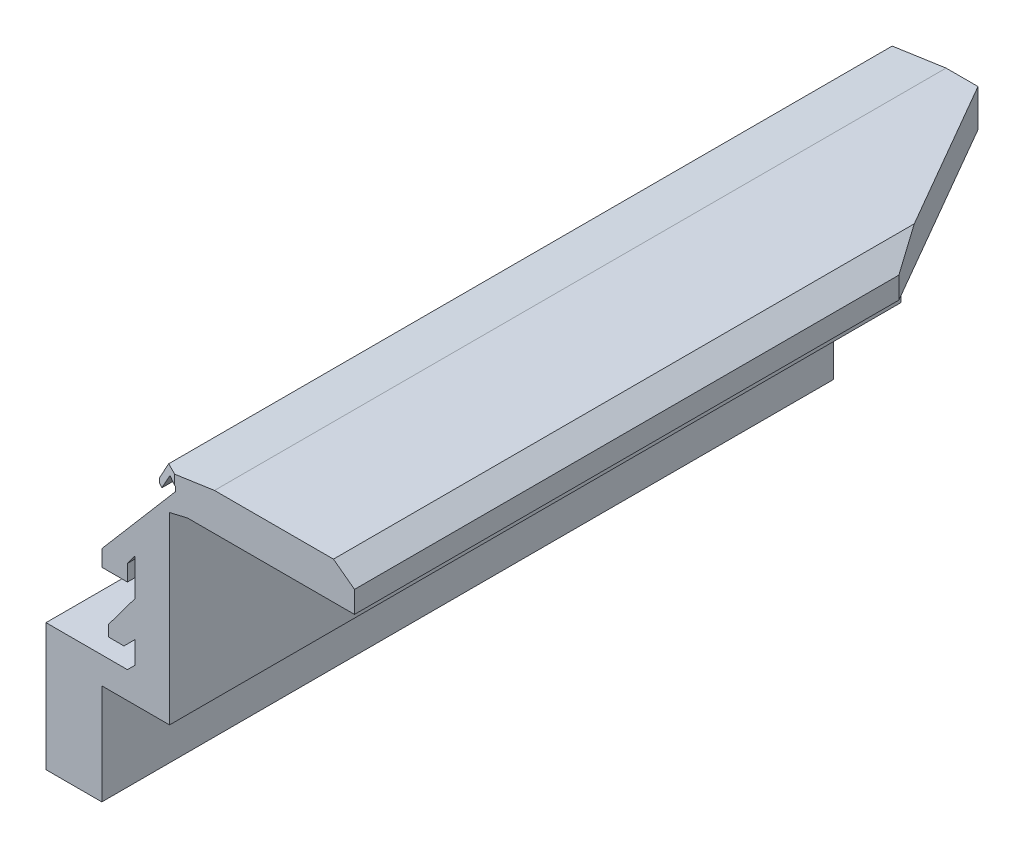
ISO-10303-21;
HEADER;
FILE_DESCRIPTION(('STEP AP214'),'2;1');
FILE_NAME('part.step','',(''),(''),'','','');
FILE_SCHEMA(('AUTOMOTIVE_DESIGN { 1 0 10303 214 1 1 1 1 }'));
ENDSEC;
DATA;
#1=APPLICATION_CONTEXT('core data for automotive mechanical design processes');
#2=APPLICATION_PROTOCOL_DEFINITION('international standard','automotive_design',2000,#1);
#3=PRODUCT_CONTEXT('',#1,'mechanical');
#4=PRODUCT('Part','Part','',(#3));
#5=PRODUCT_RELATED_PRODUCT_CATEGORY('part','',(#4));
#6=PRODUCT_DEFINITION_FORMATION('','',#4);
#7=PRODUCT_DEFINITION_CONTEXT('part definition',#1,'design');
#8=PRODUCT_DEFINITION('design','',#6,#7);
#9=PRODUCT_DEFINITION_SHAPE('','',#8);
#10=(LENGTH_UNIT() NAMED_UNIT(*) SI_UNIT(.MILLI.,.METRE.));
#11=(NAMED_UNIT(*) PLANE_ANGLE_UNIT() SI_UNIT($,.RADIAN.));
#12=(NAMED_UNIT(*) SI_UNIT($,.STERADIAN.) SOLID_ANGLE_UNIT());
#13=UNCERTAINTY_MEASURE_WITH_UNIT(LENGTH_MEASURE(1.E-05),#10,'distance_accuracy_value','');
#14=(GEOMETRIC_REPRESENTATION_CONTEXT(3) GLOBAL_UNCERTAINTY_ASSIGNED_CONTEXT((#13)) GLOBAL_UNIT_ASSIGNED_CONTEXT((#10,
#11,#12)) REPRESENTATION_CONTEXT('',''));
#15=CARTESIAN_POINT('',(0.,0.,0.));
#16=DIRECTION('',(0.,0.,1.));
#17=DIRECTION('',(1.,0.,0.));
#18=AXIS2_PLACEMENT_3D('',#15,#16,#17);
#19=CARTESIAN_POINT('',(36.549287828912,78.6677673377594,1636.));
#20=DIRECTION('',(-1.,0.,0.));
#21=DIRECTION('',(0.,0.,1.));
#22=AXIS2_PLACEMENT_3D('',#19,#20,#21);
#23=PLANE('',#22);
#24=DIRECTION('',(0.,1.,0.));
#25=VECTOR('',#24,1.);
#26=CARTESIAN_POINT('',(36.549287828912,78.6677673377594,1548.));
#27=LINE('',#26,#25);
#28=CARTESIAN_POINT('',(36.549287828912,66.5695189168191,1548.));
#29=VERTEX_POINT('',#28);
#30=CARTESIAN_POINT('',(36.549287828912,78.6677673377594,1548.));
#31=VERTEX_POINT('',#30);
#32=EDGE_CURVE('E265',#29,#31,#27,.T.);
#33=ORIENTED_EDGE('',*,*,#32,.T.);
#34=DIRECTION('',(0.,0.,-1.));
#35=VECTOR('',#34,1.);
#36=CARTESIAN_POINT('',(36.549287828912,78.6677673377594,1636.));
#37=LINE('',#36,#35);
#38=CARTESIAN_POINT('',(36.549287828912,78.6677673377594,1636.));
#39=VERTEX_POINT('',#38);
#40=EDGE_CURVE('E245',#39,#31,#37,.T.);
#41=ORIENTED_EDGE('',*,*,#40,.F.);
#42=DIRECTION('',(0.,1.,0.));
#43=VECTOR('',#42,1.);
#44=CARTESIAN_POINT('',(36.549287828912,78.6677673377594,1636.));
#45=LINE('',#44,#43);
#46=CARTESIAN_POINT('',(36.549287828912,66.5695189168191,1636.));
#47=VERTEX_POINT('',#46);
#48=EDGE_CURVE('E252',#47,#39,#45,.T.);
#49=ORIENTED_EDGE('',*,*,#48,.F.);
#50=DIRECTION('',(0.,0.,-1.));
#51=VECTOR('',#50,1.);
#52=CARTESIAN_POINT('',(36.549287828912,66.5695189168191,1636.));
#53=LINE('',#52,#51);
#54=EDGE_CURVE('E358',#47,#29,#53,.T.);
#55=ORIENTED_EDGE('',*,*,#54,.T.);
#56=EDGE_LOOP('',(#33,#41,#49,#55));
#57=FACE_BOUND('',#56,.T.);
#58=ADVANCED_FACE('F33',(#57),#23,.F.);
#59=CARTESIAN_POINT('',(44.6942077480382,78.6677673377594,1636.));
#60=DIRECTION('',(0.,1.,0.));
#61=DIRECTION('',(0.,0.,1.));
#62=AXIS2_PLACEMENT_3D('',#59,#60,#61);
#63=PLANE('',#62);
#64=DIRECTION('',(1.,0.,0.));
#65=VECTOR('',#64,1.);
#66=CARTESIAN_POINT('',(44.6942077480382,78.6677673377594,1548.));
#67=LINE('',#66,#65);
#68=CARTESIAN_POINT('',(44.6942077480382,78.6677673377594,1548.));
#69=VERTEX_POINT('',#68);
#70=EDGE_CURVE('E360',#31,#69,#67,.T.);
#71=ORIENTED_EDGE('',*,*,#70,.T.);
#72=DIRECTION('',(0.,0.,-1.));
#73=VECTOR('',#72,1.);
#74=CARTESIAN_POINT('',(44.6942077480382,78.6677673377594,1636.));
#75=LINE('',#74,#73);
#76=CARTESIAN_POINT('',(44.6942077480382,78.6677673377594,1636.));
#77=VERTEX_POINT('',#76);
#78=EDGE_CURVE('E248',#77,#69,#75,.T.);
#79=ORIENTED_EDGE('',*,*,#78,.F.);
#80=DIRECTION('',(1.,0.,0.));
#81=VECTOR('',#80,1.);
#82=CARTESIAN_POINT('',(44.6942077480382,78.6677673377594,1636.));
#83=LINE('',#82,#81);
#84=EDGE_CURVE('E241',#39,#77,#83,.T.);
#85=ORIENTED_EDGE('',*,*,#84,.F.);
#86=ORIENTED_EDGE('',*,*,#40,.T.);
#87=EDGE_LOOP('',(#71,#79,#85,#86));
#88=FACE_BOUND('',#87,.T.);
#89=ADVANCED_FACE('F243',(#88),#63,.F.);
#90=CARTESIAN_POINT('',(44.6942077480382,100.794644613452,1636.));
#91=DIRECTION('',(-1.,0.,0.));
#92=DIRECTION('',(0.,0.,1.));
#93=AXIS2_PLACEMENT_3D('',#90,#91,#92);
#94=PLANE('',#93);
#95=DIRECTION('',(0.,1.,0.));
#96=VECTOR('',#95,1.);
#97=CARTESIAN_POINT('',(44.6942077480382,100.794644613452,1548.));
#98=LINE('',#97,#96);
#99=CARTESIAN_POINT('',(44.6942077480382,100.794644613452,1548.));
#100=VERTEX_POINT('',#99);
#101=EDGE_CURVE('E362',#69,#100,#98,.T.);
#102=ORIENTED_EDGE('',*,*,#101,.T.);
#103=DIRECTION('',(0.,0.,-1.));
#104=VECTOR('',#103,1.);
#105=CARTESIAN_POINT('',(44.6942077480382,100.794644613452,1636.));
#106=LINE('',#105,#104);
#107=CARTESIAN_POINT('',(44.6942077480382,100.794644613452,1636.));
#108=VERTEX_POINT('',#107);
#109=EDGE_CURVE('E271',#108,#100,#106,.T.);
#110=ORIENTED_EDGE('',*,*,#109,.F.);
#111=DIRECTION('',(0.,1.,0.));
#112=VECTOR('',#111,1.);
#113=CARTESIAN_POINT('',(44.6942077480382,100.794644613452,1636.));
#114=LINE('',#113,#112);
#115=EDGE_CURVE('E251',#77,#108,#114,.T.);
#116=ORIENTED_EDGE('',*,*,#115,.F.);
#117=ORIENTED_EDGE('',*,*,#78,.T.);
#118=EDGE_LOOP('',(#102,#110,#116,#117));
#119=FACE_BOUND('',#118,.T.);
#120=ADVANCED_FACE('F520',(#119),#94,.F.);
#121=CARTESIAN_POINT('',(46.86035806441,101.303626457644,1636.));
#122=DIRECTION('',(-0.228740991254405,0.973487318314909,0.));
#123=DIRECTION('',(-0.973487318314909,-0.228740991254405,0.));
#124=AXIS2_PLACEMENT_3D('',#121,#122,#123);
#125=PLANE('',#124);
#126=DIRECTION('',(0.973487318314909,0.228740991254405,0.));
#127=VECTOR('',#126,1.);
#128=CARTESIAN_POINT('',(46.86035806441,101.303626457644,1548.));
#129=LINE('',#128,#127);
#130=CARTESIAN_POINT('',(46.86035806441,101.303626457644,1548.));
#131=VERTEX_POINT('',#130);
#132=EDGE_CURVE('E364',#100,#131,#129,.T.);
#133=ORIENTED_EDGE('',*,*,#132,.T.);
#134=DIRECTION('',(0.,0.,-1.));
#135=VECTOR('',#134,1.);
#136=CARTESIAN_POINT('',(46.86035806441,101.303626457644,1636.));
#137=LINE('',#136,#135);
#138=CARTESIAN_POINT('',(46.86035806441,101.303626457644,1636.));
#139=VERTEX_POINT('',#138);
#140=EDGE_CURVE('E480',#139,#131,#137,.T.);
#141=ORIENTED_EDGE('',*,*,#140,.F.);
#142=DIRECTION('',(0.973487318314909,0.228740991254405,0.));
#143=VECTOR('',#142,1.);
#144=CARTESIAN_POINT('',(46.86035806441,101.303626457644,1636.));
#145=LINE('',#144,#143);
#146=EDGE_CURVE('E489',#108,#139,#145,.T.);
#147=ORIENTED_EDGE('',*,*,#146,.F.);
#148=ORIENTED_EDGE('',*,*,#109,.T.);
#149=EDGE_LOOP('',(#133,#141,#147,#148));
#150=FACE_BOUND('',#149,.T.);
#151=ADVANCED_FACE('F487',(#150),#125,.F.);
#152=CARTESIAN_POINT('',(66.9431245759325,101.303626457644,1636.));
#153=DIRECTION('',(0.,1.,0.));
#154=DIRECTION('',(0.,0.,1.));
#155=AXIS2_PLACEMENT_3D('',#152,#153,#154);
#156=PLANE('',#155);
#157=DIRECTION('',(1.,0.,0.));
#158=VECTOR('',#157,1.);
#159=CARTESIAN_POINT('',(66.9431245759325,101.303626457644,1548.));
#160=LINE('',#159,#158);
#161=CARTESIAN_POINT('',(53.9431245759325,101.303626457644,1548.));
#162=VERTEX_POINT('',#161);
#163=EDGE_CURVE('E366',#131,#162,#160,.T.);
#164=ORIENTED_EDGE('',*,*,#163,.T.);
#165=DIRECTION('',(0.499999999999997,0.,0.86602540378444));
#166=VECTOR('',#165,1.);
#167=CARTESIAN_POINT('',(66.9431245759325,101.303626457644,1570.5166604984));
#168=LINE('',#167,#166);
#169=CARTESIAN_POINT('',(66.9431245759325,101.303626457644,1570.5166604984));
#170=VERTEX_POINT('',#169);
#171=EDGE_CURVE('E280',#162,#170,#168,.T.);
#172=ORIENTED_EDGE('',*,*,#171,.T.);
#173=DIRECTION('',(0.,0.,-1.));
#174=VECTOR('',#173,1.);
#175=CARTESIAN_POINT('',(66.9431245759325,101.303626457644,1636.));
#176=LINE('',#175,#174);
#177=CARTESIAN_POINT('',(66.9431245759325,101.303626457644,1636.));
#178=VERTEX_POINT('',#177);
#179=EDGE_CURVE('E477',#178,#170,#176,.T.);
#180=ORIENTED_EDGE('',*,*,#179,.F.);
#181=DIRECTION('',(1.,0.,0.));
#182=VECTOR('',#181,1.);
#183=CARTESIAN_POINT('',(66.9431245759325,101.303626457644,1636.));
#184=LINE('',#183,#182);
#185=EDGE_CURVE('E515',#139,#178,#184,.T.);
#186=ORIENTED_EDGE('',*,*,#185,.F.);
#187=ORIENTED_EDGE('',*,*,#140,.T.);
#188=EDGE_LOOP('',(#164,#172,#180,#186,#187));
#189=FACE_BOUND('',#188,.T.);
#190=ADVANCED_FACE('F499',(#189),#156,.F.);
#191=CARTESIAN_POINT('',(66.9431245759325,103.910825461728,1636.));
#192=DIRECTION('',(-1.,0.,0.));
#193=DIRECTION('',(0.,0.,1.));
#194=AXIS2_PLACEMENT_3D('',#191,#192,#193);
#195=PLANE('',#194);
#196=ORIENTED_EDGE('',*,*,#179,.T.);
#197=DIRECTION('',(0.,1.,0.));
#198=VECTOR('',#197,1.);
#199=CARTESIAN_POINT('',(66.9431245759325,103.910825461728,1570.5166604984));
#200=LINE('',#199,#198);
#201=CARTESIAN_POINT('',(66.9431245759325,103.910825461728,1570.5166604984));
#202=VERTEX_POINT('',#201);
#203=EDGE_CURVE('E266',#170,#202,#200,.T.);
#204=ORIENTED_EDGE('',*,*,#203,.T.);
#205=DIRECTION('',(0.,0.,-1.));
#206=VECTOR('',#205,1.);
#207=CARTESIAN_POINT('',(66.9431245759325,103.910825461728,1636.));
#208=LINE('',#207,#206);
#209=CARTESIAN_POINT('',(66.9431245759325,103.910825461728,1636.));
#210=VERTEX_POINT('',#209);
#211=EDGE_CURVE('E474',#210,#202,#208,.T.);
#212=ORIENTED_EDGE('',*,*,#211,.F.);
#213=DIRECTION('',(0.,1.,0.));
#214=VECTOR('',#213,1.);
#215=CARTESIAN_POINT('',(66.9431245759325,103.910825461728,1636.));
#216=LINE('',#215,#214);
#217=EDGE_CURVE('E514',#178,#210,#216,.T.);
#218=ORIENTED_EDGE('',*,*,#217,.F.);
#219=EDGE_LOOP('',(#196,#204,#212,#218));
#220=FACE_BOUND('',#219,.T.);
#221=ADVANCED_FACE('F508',(#220),#195,.F.);
#222=CARTESIAN_POINT('',(64.411422302581,105.79719186148,1636.));
#223=DIRECTION('',(-0.597481322535476,-0.801882827613398,0.));
#224=DIRECTION('',(0.801882827613398,-0.597481322535476,0.));
#225=AXIS2_PLACEMENT_3D('',#222,#223,#224);
#226=PLANE('',#225);
#227=ORIENTED_EDGE('',*,*,#211,.T.);
#228=DIRECTION('',(-0.468541057416322,0.349109023172947,-0.811536916877122));
#229=VECTOR('',#228,1.);
#230=CARTESIAN_POINT('',(66.9431245759325,103.910825461728,1570.5166604984));
#231=LINE('',#230,#229);
#232=CARTESIAN_POINT('',(64.411422302581,105.79719186148,1566.13162353131));
#233=VERTEX_POINT('',#232);
#234=EDGE_CURVE('E269',#202,#233,#231,.T.);
#235=ORIENTED_EDGE('',*,*,#234,.T.);
#236=DIRECTION('',(0.,0.,-1.));
#237=VECTOR('',#236,1.);
#238=CARTESIAN_POINT('',(64.411422302581,105.79719186148,1636.));
#239=LINE('',#238,#237);
#240=CARTESIAN_POINT('',(64.411422302581,105.79719186148,1636.));
#241=VERTEX_POINT('',#240);
#242=EDGE_CURVE('E471',#241,#233,#239,.T.);
#243=ORIENTED_EDGE('',*,*,#242,.F.);
#244=DIRECTION('',(-0.801882827613398,0.597481322535476,0.));
#245=VECTOR('',#244,1.);
#246=CARTESIAN_POINT('',(64.411422302581,105.79719186148,1636.));
#247=LINE('',#246,#245);
#248=EDGE_CURVE('E324',#210,#241,#247,.T.);
#249=ORIENTED_EDGE('',*,*,#248,.F.);
#250=EDGE_LOOP('',(#227,#235,#243,#249));
#251=FACE_BOUND('',#250,.T.);
#252=ADVANCED_FACE('F512',(#251),#226,.F.);
#253=CARTESIAN_POINT('',(50.1002053419369,105.79719186148,1636.));
#254=DIRECTION('',(0.,-1.,0.));
#255=DIRECTION('',(0.,0.,-1.));
#256=AXIS2_PLACEMENT_3D('',#253,#254,#255);
#257=PLANE('',#256);
#258=ORIENTED_EDGE('',*,*,#242,.T.);
#259=DIRECTION('',(-0.499999999999997,0.,-0.86602540378444));
#260=VECTOR('',#259,1.);
#261=CARTESIAN_POINT('',(66.9431245759325,105.79719186148,1570.5166604984));
#262=LINE('',#261,#260);
#263=CARTESIAN_POINT('',(53.9431245759325,105.79719186148,1548.));
#264=VERTEX_POINT('',#263);
#265=EDGE_CURVE('E276',#233,#264,#262,.T.);
#266=ORIENTED_EDGE('',*,*,#265,.T.);
#267=DIRECTION('',(-1.,0.,0.));
#268=VECTOR('',#267,1.);
#269=CARTESIAN_POINT('',(50.1002053419369,105.79719186148,1548.));
#270=LINE('',#269,#268);
#271=CARTESIAN_POINT('',(50.1002053419369,105.79719186148,1548.));
#272=VERTEX_POINT('',#271);
#273=EDGE_CURVE('E369',#264,#272,#270,.T.);
#274=ORIENTED_EDGE('',*,*,#273,.T.);
#275=DIRECTION('',(0.,0.,-1.));
#276=VECTOR('',#275,1.);
#277=CARTESIAN_POINT('',(50.1002053419369,105.79719186148,1636.));
#278=LINE('',#277,#276);
#279=CARTESIAN_POINT('',(50.1002053419369,105.79719186148,1636.));
#280=VERTEX_POINT('',#279);
#281=EDGE_CURVE('E469',#280,#272,#278,.T.);
#282=ORIENTED_EDGE('',*,*,#281,.F.);
#283=DIRECTION('',(-1.,0.,0.));
#284=VECTOR('',#283,1.);
#285=CARTESIAN_POINT('',(50.1002053419369,105.79719186148,1636.));
#286=LINE('',#285,#284);
#287=EDGE_CURVE('E318',#241,#280,#286,.T.);
#288=ORIENTED_EDGE('',*,*,#287,.F.);
#289=EDGE_LOOP('',(#258,#266,#274,#282,#288));
#290=FACE_BOUND('',#289,.T.);
#291=ADVANCED_FACE('F625',(#290),#257,.F.);
#292=CARTESIAN_POINT('',(43.6205107868831,104.850719623102,1636.));
#293=DIRECTION('',(0.144533690325346,-0.989499879919617,0.));
#294=DIRECTION('',(0.989499879919617,0.144533690325346,0.));
#295=AXIS2_PLACEMENT_3D('',#292,#293,#294);
#296=PLANE('',#295);
#297=DIRECTION('',(0.,0.,-1.));
#298=VECTOR('',#297,1.);
#299=CARTESIAN_POINT('',(43.6205107868831,104.850719623102,1636.));
#300=LINE('',#299,#298);
#301=CARTESIAN_POINT('',(43.6205107868831,104.850719623102,1635.02589759547));
#302=VERTEX_POINT('',#301);
#303=CARTESIAN_POINT('',(43.6205107868831,104.850719623102,1548.));
#304=VERTEX_POINT('',#303);
#305=EDGE_CURVE('E315',#302,#304,#300,.T.);
#306=ORIENTED_EDGE('',*,*,#305,.F.);
#307=DIRECTION('',(-0.859178498457756,-0.125497982920803,-0.496046937366502));
#308=VECTOR('',#307,1.);
#309=CARTESIAN_POINT('',(33.9755862433498,103.441910420113,1629.45739781395));
#310=LINE('',#309,#308);
#311=CARTESIAN_POINT('',(45.307705643307,105.097163815613,1636.));
#312=VERTEX_POINT('',#311);
#313=EDGE_CURVE('E11',#302,#312,#310,.F.);
#314=ORIENTED_EDGE('',*,*,#313,.T.);
#315=DIRECTION('',(-0.989499879919617,-0.144533690325346,0.));
#316=VECTOR('',#315,1.);
#317=CARTESIAN_POINT('',(43.6205107868831,104.850719623102,1636.));
#318=LINE('',#317,#316);
#319=EDGE_CURVE('E313',#280,#312,#318,.T.);
#320=ORIENTED_EDGE('',*,*,#319,.F.);
#321=ORIENTED_EDGE('',*,*,#281,.T.);
#322=DIRECTION('',(-0.989499879919617,-0.144533690325346,0.));
#323=VECTOR('',#322,1.);
#324=CARTESIAN_POINT('',(43.6205107868831,104.850719623102,1548.));
#325=LINE('',#324,#323);
#326=EDGE_CURVE('E371',#272,#304,#325,.T.);
#327=ORIENTED_EDGE('',*,*,#326,.T.);
#328=EDGE_LOOP('',(#306,#314,#320,#321,#327));
#329=FACE_BOUND('',#328,.T.);
#330=ADVANCED_FACE('F311',(#329),#296,.F.);
#331=CARTESIAN_POINT('',(40.9775786243851,101.303626457644,1636.));
#332=DIRECTION('',(0.801882827613398,-0.597481322535476,0.));
#333=DIRECTION('',(0.597481322535476,0.801882827613398,0.));
#334=AXIS2_PLACEMENT_3D('',#331,#332,#333);
#335=PLANE('',#334);
#336=DIRECTION('',(0.,0.,-1.));
#337=VECTOR('',#336,1.);
#338=CARTESIAN_POINT('',(40.9775786243851,101.303626457644,1636.));
#339=LINE('',#338,#337);
#340=CARTESIAN_POINT('',(40.9775786243851,101.303626457644,1633.5));
#341=VERTEX_POINT('',#340);
#342=CARTESIAN_POINT('',(40.9775786243851,101.303626457644,1548.));
#343=VERTEX_POINT('',#342);
#344=EDGE_CURVE('E305',#341,#343,#339,.T.);
#345=ORIENTED_EDGE('',*,*,#344,.F.);
#346=DIRECTION('',(-0.564820342493526,-0.758048354399202,-0.326099176782399));
#347=VECTOR('',#346,1.);
#348=CARTESIAN_POINT('',(-0.554822182997877,45.5627727424721,1609.52125721377));
#349=LINE('',#348,#347);
#350=EDGE_CURVE('E41',#341,#302,#349,.F.);
#351=ORIENTED_EDGE('',*,*,#350,.T.);
#352=ORIENTED_EDGE('',*,*,#305,.T.);
#353=DIRECTION('',(-0.597481322535476,-0.801882827613398,0.));
#354=VECTOR('',#353,1.);
#355=CARTESIAN_POINT('',(40.9775786243851,101.303626457644,1548.));
#356=LINE('',#355,#354);
#357=EDGE_CURVE('E373',#304,#343,#356,.T.);
#358=ORIENTED_EDGE('',*,*,#357,.T.);
#359=EDGE_LOOP('',(#345,#351,#352,#358));
#360=FACE_BOUND('',#359,.T.);
#361=ADVANCED_FACE('F620',(#360),#335,.F.);
#362=CARTESIAN_POINT('',(40.9775786243851,100.794644613452,1636.));
#363=DIRECTION('',(1.,0.,0.));
#364=DIRECTION('',(0.,0.,-1.));
#365=AXIS2_PLACEMENT_3D('',#362,#363,#364);
#366=PLANE('',#365);
#367=DIRECTION('',(0.,0.,-1.));
#368=VECTOR('',#367,1.);
#369=CARTESIAN_POINT('',(40.9775786243851,100.794644613452,1636.));
#370=LINE('',#369,#368);
#371=CARTESIAN_POINT('',(40.9775786243851,100.794644613452,1633.5));
#372=VERTEX_POINT('',#371);
#373=CARTESIAN_POINT('',(40.9775786243851,100.794644613452,1548.));
#374=VERTEX_POINT('',#373);
#375=EDGE_CURVE('E296',#372,#374,#370,.T.);
#376=ORIENTED_EDGE('',*,*,#375,.F.);
#377=DIRECTION('',(0.,1.,0.));
#378=VECTOR('',#377,1.);
#379=CARTESIAN_POINT('',(40.9775786243851,100.794644613452,1633.5));
#380=LINE('',#379,#378);
#381=EDGE_CURVE('E55',#372,#341,#380,.T.);
#382=ORIENTED_EDGE('',*,*,#381,.T.);
#383=ORIENTED_EDGE('',*,*,#344,.T.);
#384=DIRECTION('',(0.,-1.,0.));
#385=VECTOR('',#384,1.);
#386=CARTESIAN_POINT('',(40.9775786243851,100.794644613452,1548.));
#387=LINE('',#386,#385);
#388=EDGE_CURVE('E303',#343,#374,#387,.T.);
#389=ORIENTED_EDGE('',*,*,#388,.T.);
#390=EDGE_LOOP('',(#376,#382,#383,#389));
#391=FACE_BOUND('',#390,.T.);
#392=ADVANCED_FACE('F301',(#391),#366,.F.);
#393=CARTESIAN_POINT('',(41.6606858363263,100.794644613452,1636.));
#394=DIRECTION('',(0.,1.,0.));
#395=DIRECTION('',(0.,0.,1.));
#396=AXIS2_PLACEMENT_3D('',#393,#394,#395);
#397=PLANE('',#396);
#398=DIRECTION('',(0.,0.,-1.));
#399=VECTOR('',#398,1.);
#400=CARTESIAN_POINT('',(41.6606858363263,100.794644613452,1636.));
#401=LINE('',#400,#399);
#402=CARTESIAN_POINT('',(41.6606858363263,100.794644613452,1633.8943921327));
#403=VERTEX_POINT('',#402);
#404=CARTESIAN_POINT('',(41.6606858363263,100.794644613452,1548.));
#405=VERTEX_POINT('',#404);
#406=EDGE_CURVE('E298',#403,#405,#401,.T.);
#407=ORIENTED_EDGE('',*,*,#406,.F.);
#408=DIRECTION('',(0.866025403784448,0.,0.499999999999983));
#409=VECTOR('',#408,1.);
#410=CARTESIAN_POINT('',(45.307705643307,100.794644613452,1636.));
#411=LINE('',#410,#409);
#412=EDGE_CURVE('E289',#403,#372,#411,.F.);
#413=ORIENTED_EDGE('',*,*,#412,.T.);
#414=ORIENTED_EDGE('',*,*,#375,.T.);
#415=DIRECTION('',(1.,0.,0.));
#416=VECTOR('',#415,1.);
#417=CARTESIAN_POINT('',(41.6606858363263,100.794644613452,1548.));
#418=LINE('',#417,#416);
#419=EDGE_CURVE('E377',#374,#405,#418,.T.);
#420=ORIENTED_EDGE('',*,*,#419,.T.);
#421=EDGE_LOOP('',(#407,#413,#414,#420));
#422=FACE_BOUND('',#421,.T.);
#423=ADVANCED_FACE('F294',(#422),#397,.F.);
#424=CARTESIAN_POINT('',(43.9825460762182,103.910825461728,1636.));
#425=DIRECTION('',(-0.801882827613399,0.597481322535474,0.));
#426=DIRECTION('',(-0.597481322535474,-0.801882827613399,0.));
#427=AXIS2_PLACEMENT_3D('',#424,#425,#426);
#428=PLANE('',#427);
#429=DIRECTION('',(0.,0.,-1.));
#430=VECTOR('',#429,1.);
#431=CARTESIAN_POINT('',(43.9825460762182,103.910825461728,1636.));
#432=LINE('',#431,#430);
#433=CARTESIAN_POINT('',(43.9825460762182,103.910825461728,1635.23491876722));
#434=VERTEX_POINT('',#433);
#435=CARTESIAN_POINT('',(43.9825460762182,103.910825461728,1548.));
#436=VERTEX_POINT('',#435);
#437=EDGE_CURVE('E464',#434,#436,#432,.T.);
#438=ORIENTED_EDGE('',*,*,#437,.F.);
#439=DIRECTION('',(0.564820342493524,0.758048354399203,0.326099176782398));
#440=VECTOR('',#439,1.);
#441=CARTESIAN_POINT('',(0.0556429482273038,44.9562975794246,1609.87370942161));
#442=LINE('',#441,#440);
#443=EDGE_CURVE('E287',#434,#403,#442,.F.);
#444=ORIENTED_EDGE('',*,*,#443,.T.);
#445=ORIENTED_EDGE('',*,*,#406,.T.);
#446=DIRECTION('',(0.597481322535474,0.801882827613399,0.));
#447=VECTOR('',#446,1.);
#448=CARTESIAN_POINT('',(43.9825460762182,103.910825461728,1548.));
#449=LINE('',#448,#447);
#450=EDGE_CURVE('E379',#405,#436,#449,.T.);
#451=ORIENTED_EDGE('',*,*,#450,.T.);
#452=EDGE_LOOP('',(#438,#444,#445,#451));
#453=FACE_BOUND('',#452,.T.);
#454=ADVANCED_FACE('F611',(#453),#428,.F.);
#455=CARTESIAN_POINT('',(45.4058694198582,103.910825461728,1636.));
#456=DIRECTION('',(0.,1.,0.));
#457=DIRECTION('',(-1.,0.,0.));
#458=AXIS2_PLACEMENT_3D('',#455,#456,#457);
#459=PLANE('',#458);
#460=DIRECTION('',(1.,0.,0.));
#461=VECTOR('',#460,1.);
#462=CARTESIAN_POINT('',(45.4058694198582,103.910825461728,1636.));
#463=LINE('',#462,#461);
#464=CARTESIAN_POINT('',(45.307705643307,103.910825461728,1636.));
#465=VERTEX_POINT('',#464);
#466=CARTESIAN_POINT('',(45.4058694198582,103.910825461728,1636.));
#467=VERTEX_POINT('',#466);
#468=EDGE_CURVE('E320',#465,#467,#463,.T.);
#469=ORIENTED_EDGE('',*,*,#468,.F.);
#470=DIRECTION('',(0.866025403784448,0.,0.499999999999983));
#471=VECTOR('',#470,1.);
#472=CARTESIAN_POINT('',(45.3077056433078,103.910825461728,1636.));
#473=LINE('',#472,#471);
#474=EDGE_CURVE('E285',#465,#434,#473,.F.);
#475=ORIENTED_EDGE('',*,*,#474,.T.);
#476=ORIENTED_EDGE('',*,*,#437,.T.);
#477=DIRECTION('',(1.,0.,0.));
#478=VECTOR('',#477,1.);
#479=CARTESIAN_POINT('',(45.4058694198582,103.910825461728,1548.));
#480=LINE('',#479,#478);
#481=CARTESIAN_POINT('',(45.4058694198582,103.910825461728,1548.));
#482=VERTEX_POINT('',#481);
#483=EDGE_CURVE('E382',#436,#482,#480,.T.);
#484=ORIENTED_EDGE('',*,*,#483,.T.);
#485=DIRECTION('',(0.,0.,-1.));
#486=VECTOR('',#485,1.);
#487=CARTESIAN_POINT('',(45.4058694198582,103.910825461728,1636.));
#488=LINE('',#487,#486);
#489=EDGE_CURVE('E461',#467,#482,#488,.T.);
#490=ORIENTED_EDGE('',*,*,#489,.F.);
#491=EDGE_LOOP('',(#469,#475,#476,#484,#490));
#492=FACE_BOUND('',#491,.T.);
#493=ADVANCED_FACE('F607',(#492),#459,.F.);
#494=CARTESIAN_POINT('',(45.4058694198582,103.324751143759,1636.));
#495=DIRECTION('',(1.,0.,0.));
#496=DIRECTION('',(0.,0.,-1.));
#497=AXIS2_PLACEMENT_3D('',#494,#495,#496);
#498=PLANE('',#497);
#499=DIRECTION('',(0.,-1.,0.));
#500=VECTOR('',#499,1.);
#501=CARTESIAN_POINT('',(45.4058694198582,103.324751143759,1548.));
#502=LINE('',#501,#500);
#503=CARTESIAN_POINT('',(45.4058694198582,103.324751143759,1548.));
#504=VERTEX_POINT('',#503);
#505=EDGE_CURVE('E384',#482,#504,#502,.T.);
#506=ORIENTED_EDGE('',*,*,#505,.T.);
#507=DIRECTION('',(0.,0.,-1.));
#508=VECTOR('',#507,1.);
#509=CARTESIAN_POINT('',(45.4058694198582,103.324751143759,1636.));
#510=LINE('',#509,#508);
#511=CARTESIAN_POINT('',(45.4058694198582,103.324751143759,1636.));
#512=VERTEX_POINT('',#511);
#513=EDGE_CURVE('E458',#512,#504,#510,.T.);
#514=ORIENTED_EDGE('',*,*,#513,.F.);
#515=DIRECTION('',(0.,-1.,0.));
#516=VECTOR('',#515,1.);
#517=CARTESIAN_POINT('',(45.4058694198582,103.324751143759,1636.));
#518=LINE('',#517,#516);
#519=EDGE_CURVE('E322',#467,#512,#518,.T.);
#520=ORIENTED_EDGE('',*,*,#519,.F.);
#521=ORIENTED_EDGE('',*,*,#489,.T.);
#522=EDGE_LOOP('',(#506,#514,#520,#521));
#523=FACE_BOUND('',#522,.T.);
#524=ADVANCED_FACE('F603',(#523),#498,.F.);
#525=CARTESIAN_POINT('',(36.549287828912,92.9626928076301,1636.));
#526=DIRECTION('',(0.760168699439389,-0.649725748599075,0.));
#527=DIRECTION('',(0.649725748599075,0.760168699439389,0.));
#528=AXIS2_PLACEMENT_3D('',#525,#526,#527);
#529=PLANE('',#528);
#530=DIRECTION('',(-0.649725748599075,-0.760168699439389,0.));
#531=VECTOR('',#530,1.);
#532=CARTESIAN_POINT('',(36.549287828912,92.9626928076301,1548.));
#533=LINE('',#532,#531);
#534=CARTESIAN_POINT('',(36.549287828912,92.9626928076301,1548.));
#535=VERTEX_POINT('',#534);
#536=EDGE_CURVE('E386',#504,#535,#533,.T.);
#537=ORIENTED_EDGE('',*,*,#536,.T.);
#538=DIRECTION('',(0.,0.,-1.));
#539=VECTOR('',#538,1.);
#540=CARTESIAN_POINT('',(36.549287828912,92.9626928076301,1636.));
#541=LINE('',#540,#539);
#542=CARTESIAN_POINT('',(36.549287828912,92.9626928076301,1636.));
#543=VERTEX_POINT('',#542);
#544=EDGE_CURVE('E455',#543,#535,#541,.T.);
#545=ORIENTED_EDGE('',*,*,#544,.F.);
#546=DIRECTION('',(-0.649725748599075,-0.760168699439389,0.));
#547=VECTOR('',#546,1.);
#548=CARTESIAN_POINT('',(36.549287828912,92.9626928076301,1636.));
#549=LINE('',#548,#547);
#550=EDGE_CURVE('E329',#512,#543,#549,.T.);
#551=ORIENTED_EDGE('',*,*,#550,.F.);
#552=ORIENTED_EDGE('',*,*,#513,.T.);
#553=EDGE_LOOP('',(#537,#545,#551,#552));
#554=FACE_BOUND('',#553,.T.);
#555=ADVANCED_FACE('F599',(#554),#529,.F.);
#556=CARTESIAN_POINT('',(36.549287828912,91.0171904664008,1636.));
#557=DIRECTION('',(1.,0.,0.));
#558=DIRECTION('',(0.,0.,-1.));
#559=AXIS2_PLACEMENT_3D('',#556,#557,#558);
#560=PLANE('',#559);
#561=DIRECTION('',(0.,-1.,0.));
#562=VECTOR('',#561,1.);
#563=CARTESIAN_POINT('',(36.549287828912,91.0171904664008,1548.));
#564=LINE('',#563,#562);
#565=CARTESIAN_POINT('',(36.549287828912,91.0171904664008,1548.));
#566=VERTEX_POINT('',#565);
#567=EDGE_CURVE('E388',#535,#566,#564,.T.);
#568=ORIENTED_EDGE('',*,*,#567,.T.);
#569=DIRECTION('',(0.,0.,-1.));
#570=VECTOR('',#569,1.);
#571=CARTESIAN_POINT('',(36.549287828912,91.0171904664008,1636.));
#572=LINE('',#571,#570);
#573=CARTESIAN_POINT('',(36.549287828912,91.0171904664008,1636.));
#574=VERTEX_POINT('',#573);
#575=EDGE_CURVE('E452',#574,#566,#572,.T.);
#576=ORIENTED_EDGE('',*,*,#575,.F.);
#577=DIRECTION('',(0.,-1.,0.));
#578=VECTOR('',#577,1.);
#579=CARTESIAN_POINT('',(36.549287828912,91.0171904664008,1636.));
#580=LINE('',#579,#578);
#581=EDGE_CURVE('E331',#543,#574,#580,.T.);
#582=ORIENTED_EDGE('',*,*,#581,.F.);
#583=ORIENTED_EDGE('',*,*,#544,.T.);
#584=EDGE_LOOP('',(#568,#576,#582,#583));
#585=FACE_BOUND('',#584,.T.);
#586=ADVANCED_FACE('F595',(#585),#560,.F.);
#587=CARTESIAN_POINT('',(39.628851142731,91.0171904664008,1636.));
#588=DIRECTION('',(0.,1.,0.));
#589=DIRECTION('',(0.,0.,1.));
#590=AXIS2_PLACEMENT_3D('',#587,#588,#589);
#591=PLANE('',#590);
#592=DIRECTION('',(1.,0.,0.));
#593=VECTOR('',#592,1.);
#594=CARTESIAN_POINT('',(39.628851142731,91.0171904664008,1548.));
#595=LINE('',#594,#593);
#596=CARTESIAN_POINT('',(39.628851142731,91.0171904664008,1548.));
#597=VERTEX_POINT('',#596);
#598=EDGE_CURVE('E390',#566,#597,#595,.T.);
#599=ORIENTED_EDGE('',*,*,#598,.T.);
#600=DIRECTION('',(0.,0.,-1.));
#601=VECTOR('',#600,1.);
#602=CARTESIAN_POINT('',(39.628851142731,91.0171904664008,1636.));
#603=LINE('',#602,#601);
#604=CARTESIAN_POINT('',(39.628851142731,91.0171904664008,1636.));
#605=VERTEX_POINT('',#604);
#606=EDGE_CURVE('E449',#605,#597,#603,.T.);
#607=ORIENTED_EDGE('',*,*,#606,.F.);
#608=DIRECTION('',(1.,0.,0.));
#609=VECTOR('',#608,1.);
#610=CARTESIAN_POINT('',(39.628851142731,91.0171904664008,1636.));
#611=LINE('',#610,#609);
#612=EDGE_CURVE('E333',#574,#605,#611,.T.);
#613=ORIENTED_EDGE('',*,*,#612,.F.);
#614=ORIENTED_EDGE('',*,*,#575,.T.);
#615=EDGE_LOOP('',(#599,#607,#613,#614));
#616=FACE_BOUND('',#615,.T.);
#617=ADVANCED_FACE('F591',(#616),#591,.F.);
#618=CARTESIAN_POINT('',(39.628851142731,92.9626928076301,1636.));
#619=DIRECTION('',(-1.,0.,0.));
#620=DIRECTION('',(0.,-1.,0.));
#621=AXIS2_PLACEMENT_3D('',#618,#619,#620);
#622=PLANE('',#621);
#623=DIRECTION('',(0.,1.,0.));
#624=VECTOR('',#623,1.);
#625=CARTESIAN_POINT('',(39.628851142731,92.9626928076301,1548.));
#626=LINE('',#625,#624);
#627=CARTESIAN_POINT('',(39.628851142731,92.9626928076301,1548.));
#628=VERTEX_POINT('',#627);
#629=EDGE_CURVE('E392',#597,#628,#626,.T.);
#630=ORIENTED_EDGE('',*,*,#629,.T.);
#631=DIRECTION('',(0.,0.,-1.));
#632=VECTOR('',#631,1.);
#633=CARTESIAN_POINT('',(39.628851142731,92.9626928076301,1636.));
#634=LINE('',#633,#632);
#635=CARTESIAN_POINT('',(39.628851142731,92.9626928076301,1636.));
#636=VERTEX_POINT('',#635);
#637=EDGE_CURVE('E446',#636,#628,#634,.T.);
#638=ORIENTED_EDGE('',*,*,#637,.F.);
#639=DIRECTION('',(0.,1.,0.));
#640=VECTOR('',#639,1.);
#641=CARTESIAN_POINT('',(39.628851142731,92.9626928076301,1636.));
#642=LINE('',#641,#640);
#643=EDGE_CURVE('E335',#605,#636,#642,.T.);
#644=ORIENTED_EDGE('',*,*,#643,.F.);
#645=ORIENTED_EDGE('',*,*,#606,.T.);
#646=EDGE_LOOP('',(#630,#638,#644,#645));
#647=FACE_BOUND('',#646,.T.);
#648=ADVANCED_FACE('F587',(#647),#622,.F.);
#649=CARTESIAN_POINT('',(40.5498250709687,94.1987367639491,1636.));
#650=DIRECTION('',(-0.801882827613399,0.597481322535475,0.));
#651=DIRECTION('',(-0.597481322535475,-0.801882827613399,0.));
#652=AXIS2_PLACEMENT_3D('',#649,#650,#651);
#653=PLANE('',#652);
#654=DIRECTION('',(0.597481322535475,0.801882827613399,0.));
#655=VECTOR('',#654,1.);
#656=CARTESIAN_POINT('',(40.5498250709687,94.1987367639491,1548.));
#657=LINE('',#656,#655);
#658=CARTESIAN_POINT('',(40.5498250709687,94.1987367639491,1548.));
#659=VERTEX_POINT('',#658);
#660=EDGE_CURVE('E394',#628,#659,#657,.T.);
#661=ORIENTED_EDGE('',*,*,#660,.T.);
#662=DIRECTION('',(0.,0.,-1.));
#663=VECTOR('',#662,1.);
#664=CARTESIAN_POINT('',(40.5498250709687,94.1987367639491,1636.));
#665=LINE('',#664,#663);
#666=CARTESIAN_POINT('',(40.5498250709687,94.1987367639491,1636.));
#667=VERTEX_POINT('',#666);
#668=EDGE_CURVE('E443',#667,#659,#665,.T.);
#669=ORIENTED_EDGE('',*,*,#668,.F.);
#670=DIRECTION('',(0.597481322535475,0.801882827613399,0.));
#671=VECTOR('',#670,1.);
#672=CARTESIAN_POINT('',(40.5498250709687,94.1987367639491,1636.));
#673=LINE('',#672,#671);
#674=EDGE_CURVE('E337',#636,#667,#673,.T.);
#675=ORIENTED_EDGE('',*,*,#674,.F.);
#676=ORIENTED_EDGE('',*,*,#637,.T.);
#677=EDGE_LOOP('',(#661,#669,#675,#676));
#678=FACE_BOUND('',#677,.T.);
#679=ADVANCED_FACE('F583',(#678),#653,.F.);
#680=CARTESIAN_POINT('',(40.5498250709687,89.7613169278949,1636.));
#681=DIRECTION('',(1.,0.,0.));
#682=DIRECTION('',(0.,0.,-1.));
#683=AXIS2_PLACEMENT_3D('',#680,#681,#682);
#684=PLANE('',#683);
#685=DIRECTION('',(0.,-1.,0.));
#686=VECTOR('',#685,1.);
#687=CARTESIAN_POINT('',(40.5498250709687,89.7613169278949,1548.));
#688=LINE('',#687,#686);
#689=CARTESIAN_POINT('',(40.5498250709687,89.7613169278949,1548.));
#690=VERTEX_POINT('',#689);
#691=EDGE_CURVE('E396',#659,#690,#688,.T.);
#692=ORIENTED_EDGE('',*,*,#691,.T.);
#693=DIRECTION('',(0.,0.,-1.));
#694=VECTOR('',#693,1.);
#695=CARTESIAN_POINT('',(40.5498250709687,89.7613169278949,1636.));
#696=LINE('',#695,#694);
#697=CARTESIAN_POINT('',(40.5498250709687,89.7613169278949,1636.));
#698=VERTEX_POINT('',#697);
#699=EDGE_CURVE('E440',#698,#690,#696,.T.);
#700=ORIENTED_EDGE('',*,*,#699,.F.);
#701=DIRECTION('',(0.,-1.,0.));
#702=VECTOR('',#701,1.);
#703=CARTESIAN_POINT('',(40.5498250709687,89.7613169278949,1636.));
#704=LINE('',#703,#702);
#705=EDGE_CURVE('E339',#667,#698,#704,.T.);
#706=ORIENTED_EDGE('',*,*,#705,.F.);
#707=ORIENTED_EDGE('',*,*,#668,.T.);
#708=EDGE_LOOP('',(#692,#700,#706,#707));
#709=FACE_BOUND('',#708,.T.);
#710=ADVANCED_FACE('F579',(#709),#684,.F.);
#711=CARTESIAN_POINT('',(37.3682787734204,85.4913468969748,1636.));
#712=DIRECTION('',(0.801882827613398,-0.597481322535476,0.));
#713=DIRECTION('',(0.597481322535475,0.801882827613398,0.));
#714=AXIS2_PLACEMENT_3D('',#711,#712,#713);
#715=PLANE('',#714);
#716=DIRECTION('',(-0.597481322535475,-0.801882827613398,0.));
#717=VECTOR('',#716,1.);
#718=CARTESIAN_POINT('',(37.3682787734204,85.4913468969748,1548.));
#719=LINE('',#718,#717);
#720=CARTESIAN_POINT('',(37.3682787734204,85.4913468969748,1548.));
#721=VERTEX_POINT('',#720);
#722=EDGE_CURVE('E398',#690,#721,#719,.T.);
#723=ORIENTED_EDGE('',*,*,#722,.T.);
#724=DIRECTION('',(0.,0.,-1.));
#725=VECTOR('',#724,1.);
#726=CARTESIAN_POINT('',(37.3682787734204,85.4913468969748,1636.));
#727=LINE('',#726,#725);
#728=CARTESIAN_POINT('',(37.3682787734204,85.4913468969748,1636.));
#729=VERTEX_POINT('',#728);
#730=EDGE_CURVE('E437',#729,#721,#727,.T.);
#731=ORIENTED_EDGE('',*,*,#730,.F.);
#732=DIRECTION('',(-0.597481322535475,-0.801882827613398,0.));
#733=VECTOR('',#732,1.);
#734=CARTESIAN_POINT('',(37.3682787734204,85.4913468969748,1636.));
#735=LINE('',#734,#733);
#736=EDGE_CURVE('E341',#698,#729,#735,.T.);
#737=ORIENTED_EDGE('',*,*,#736,.F.);
#738=ORIENTED_EDGE('',*,*,#699,.T.);
#739=EDGE_LOOP('',(#723,#731,#737,#738));
#740=FACE_BOUND('',#739,.T.);
#741=ADVANCED_FACE('F575',(#740),#715,.F.);
#742=CARTESIAN_POINT('',(37.3682787734204,84.1517484559018,1636.));
#743=DIRECTION('',(1.,0.,0.));
#744=DIRECTION('',(0.,0.,-1.));
#745=AXIS2_PLACEMENT_3D('',#742,#743,#744);
#746=PLANE('',#745);
#747=DIRECTION('',(0.,-1.,0.));
#748=VECTOR('',#747,1.);
#749=CARTESIAN_POINT('',(37.3682787734204,84.1517484559018,1548.));
#750=LINE('',#749,#748);
#751=CARTESIAN_POINT('',(37.3682787734204,84.1517484559018,1548.));
#752=VERTEX_POINT('',#751);
#753=EDGE_CURVE('E400',#721,#752,#750,.T.);
#754=ORIENTED_EDGE('',*,*,#753,.T.);
#755=DIRECTION('',(0.,0.,-1.));
#756=VECTOR('',#755,1.);
#757=CARTESIAN_POINT('',(37.3682787734204,84.1517484559018,1636.));
#758=LINE('',#757,#756);
#759=CARTESIAN_POINT('',(37.3682787734204,84.1517484559018,1636.));
#760=VERTEX_POINT('',#759);
#761=EDGE_CURVE('E434',#760,#752,#758,.T.);
#762=ORIENTED_EDGE('',*,*,#761,.F.);
#763=DIRECTION('',(0.,-1.,0.));
#764=VECTOR('',#763,1.);
#765=CARTESIAN_POINT('',(37.3682787734204,84.1517484559018,1636.));
#766=LINE('',#765,#764);
#767=EDGE_CURVE('E343',#729,#760,#766,.T.);
#768=ORIENTED_EDGE('',*,*,#767,.F.);
#769=ORIENTED_EDGE('',*,*,#730,.T.);
#770=EDGE_LOOP('',(#754,#762,#768,#769));
#771=FACE_BOUND('',#770,.T.);
#772=ADVANCED_FACE('F571',(#771),#746,.F.);
#773=CARTESIAN_POINT('',(39.2102266298957,84.1517484559018,1636.));
#774=DIRECTION('',(0.,1.,0.));
#775=DIRECTION('',(0.,0.,1.));
#776=AXIS2_PLACEMENT_3D('',#773,#774,#775);
#777=PLANE('',#776);
#778=DIRECTION('',(1.,0.,0.));
#779=VECTOR('',#778,1.);
#780=CARTESIAN_POINT('',(39.2102266298957,84.1517484559018,1548.));
#781=LINE('',#780,#779);
#782=CARTESIAN_POINT('',(39.2102266298957,84.1517484559018,1548.));
#783=VERTEX_POINT('',#782);
#784=EDGE_CURVE('E402',#752,#783,#781,.T.);
#785=ORIENTED_EDGE('',*,*,#784,.T.);
#786=DIRECTION('',(0.,0.,-1.));
#787=VECTOR('',#786,1.);
#788=CARTESIAN_POINT('',(39.2102266298957,84.1517484559018,1636.));
#789=LINE('',#788,#787);
#790=CARTESIAN_POINT('',(39.2102266298957,84.1517484559018,1636.));
#791=VERTEX_POINT('',#790);
#792=EDGE_CURVE('E431',#791,#783,#789,.T.);
#793=ORIENTED_EDGE('',*,*,#792,.F.);
#794=DIRECTION('',(1.,0.,0.));
#795=VECTOR('',#794,1.);
#796=CARTESIAN_POINT('',(39.2102266298957,84.1517484559018,1636.));
#797=LINE('',#796,#795);
#798=EDGE_CURVE('E345',#760,#791,#797,.T.);
#799=ORIENTED_EDGE('',*,*,#798,.F.);
#800=ORIENTED_EDGE('',*,*,#761,.T.);
#801=EDGE_LOOP('',(#785,#793,#799,#800));
#802=FACE_BOUND('',#801,.T.);
#803=ADVANCED_FACE('F567',(#802),#777,.F.);
#804=CARTESIAN_POINT('',(40.5498250709687,85.4913468969748,1636.));
#805=DIRECTION('',(-0.707106781186549,0.707106781186546,0.));
#806=DIRECTION('',(-0.707106781186546,-0.707106781186549,0.));
#807=AXIS2_PLACEMENT_3D('',#804,#805,#806);
#808=PLANE('',#807);
#809=DIRECTION('',(0.707106781186546,0.707106781186549,0.));
#810=VECTOR('',#809,1.);
#811=CARTESIAN_POINT('',(40.5498250709687,85.4913468969748,1548.));
#812=LINE('',#811,#810);
#813=CARTESIAN_POINT('',(40.5498250709687,85.4913468969748,1548.));
#814=VERTEX_POINT('',#813);
#815=EDGE_CURVE('E404',#783,#814,#812,.T.);
#816=ORIENTED_EDGE('',*,*,#815,.T.);
#817=DIRECTION('',(0.,0.,-1.));
#818=VECTOR('',#817,1.);
#819=CARTESIAN_POINT('',(40.5498250709687,85.4913468969748,1636.));
#820=LINE('',#819,#818);
#821=CARTESIAN_POINT('',(40.5498250709687,85.4913468969748,1636.));
#822=VERTEX_POINT('',#821);
#823=EDGE_CURVE('E428',#822,#814,#820,.T.);
#824=ORIENTED_EDGE('',*,*,#823,.F.);
#825=DIRECTION('',(0.707106781186546,0.707106781186549,0.));
#826=VECTOR('',#825,1.);
#827=CARTESIAN_POINT('',(40.5498250709687,85.4913468969748,1636.));
#828=LINE('',#827,#826);
#829=EDGE_CURVE('E347',#791,#822,#828,.T.);
#830=ORIENTED_EDGE('',*,*,#829,.F.);
#831=ORIENTED_EDGE('',*,*,#792,.T.);
#832=EDGE_LOOP('',(#816,#824,#830,#831));
#833=FACE_BOUND('',#832,.T.);
#834=ADVANCED_FACE('F563',(#833),#808,.F.);
#835=CARTESIAN_POINT('',(40.5498250709687,82.8121500148289,1636.));
#836=DIRECTION('',(1.,0.,0.));
#837=DIRECTION('',(0.,0.,-1.));
#838=AXIS2_PLACEMENT_3D('',#835,#836,#837);
#839=PLANE('',#838);
#840=DIRECTION('',(0.,-1.,0.));
#841=VECTOR('',#840,1.);
#842=CARTESIAN_POINT('',(40.5498250709687,82.8121500148289,1548.));
#843=LINE('',#842,#841);
#844=CARTESIAN_POINT('',(40.5498250709687,82.8121500148289,1548.));
#845=VERTEX_POINT('',#844);
#846=EDGE_CURVE('E406',#814,#845,#843,.T.);
#847=ORIENTED_EDGE('',*,*,#846,.T.);
#848=DIRECTION('',(0.,0.,-1.));
#849=VECTOR('',#848,1.);
#850=CARTESIAN_POINT('',(40.5498250709687,82.8121500148289,1636.));
#851=LINE('',#850,#849);
#852=CARTESIAN_POINT('',(40.5498250709687,82.8121500148289,1636.));
#853=VERTEX_POINT('',#852);
#854=EDGE_CURVE('E425',#853,#845,#851,.T.);
#855=ORIENTED_EDGE('',*,*,#854,.F.);
#856=DIRECTION('',(0.,-1.,0.));
#857=VECTOR('',#856,1.);
#858=CARTESIAN_POINT('',(40.5498250709687,82.8121500148289,1636.));
#859=LINE('',#858,#857);
#860=EDGE_CURVE('E349',#822,#853,#859,.T.);
#861=ORIENTED_EDGE('',*,*,#860,.F.);
#862=ORIENTED_EDGE('',*,*,#823,.T.);
#863=EDGE_LOOP('',(#847,#855,#861,#862));
#864=FACE_BOUND('',#863,.T.);
#865=ADVANCED_FACE('F559',(#864),#839,.F.);
#866=CARTESIAN_POINT('',(39.628851142731,81.8911760865912,1636.));
#867=DIRECTION('',(0.70710678118655,-0.707106781186545,0.));
#868=DIRECTION('',(0.707106781186545,0.70710678118655,0.));
#869=AXIS2_PLACEMENT_3D('',#866,#867,#868);
#870=PLANE('',#869);
#871=DIRECTION('',(-0.707106781186545,-0.70710678118655,0.));
#872=VECTOR('',#871,1.);
#873=CARTESIAN_POINT('',(39.628851142731,81.8911760865912,1548.));
#874=LINE('',#873,#872);
#875=CARTESIAN_POINT('',(39.628851142731,81.8911760865912,1548.));
#876=VERTEX_POINT('',#875);
#877=EDGE_CURVE('E408',#845,#876,#874,.T.);
#878=ORIENTED_EDGE('',*,*,#877,.T.);
#879=DIRECTION('',(0.,0.,-1.));
#880=VECTOR('',#879,1.);
#881=CARTESIAN_POINT('',(39.628851142731,81.8911760865912,1636.));
#882=LINE('',#881,#880);
#883=CARTESIAN_POINT('',(39.628851142731,81.8911760865912,1636.));
#884=VERTEX_POINT('',#883);
#885=EDGE_CURVE('E422',#884,#876,#882,.T.);
#886=ORIENTED_EDGE('',*,*,#885,.F.);
#887=DIRECTION('',(-0.707106781186545,-0.70710678118655,0.));
#888=VECTOR('',#887,1.);
#889=CARTESIAN_POINT('',(39.628851142731,81.8911760865912,1636.));
#890=LINE('',#889,#888);
#891=EDGE_CURVE('E351',#853,#884,#890,.T.);
#892=ORIENTED_EDGE('',*,*,#891,.F.);
#893=ORIENTED_EDGE('',*,*,#854,.T.);
#894=EDGE_LOOP('',(#878,#886,#892,#893));
#895=FACE_BOUND('',#894,.T.);
#896=ADVANCED_FACE('F555',(#895),#870,.F.);
#897=CARTESIAN_POINT('',(29.8330375423849,81.8911760865912,1636.));
#898=DIRECTION('',(0.,-1.,0.));
#899=DIRECTION('',(0.,0.,-1.));
#900=AXIS2_PLACEMENT_3D('',#897,#898,#899);
#901=PLANE('',#900);
#902=DIRECTION('',(-1.,0.,0.));
#903=VECTOR('',#902,1.);
#904=CARTESIAN_POINT('',(29.8330375423849,81.8911760865912,1548.));
#905=LINE('',#904,#903);
#906=CARTESIAN_POINT('',(29.8330375423849,81.8911760865912,1548.));
#907=VERTEX_POINT('',#906);
#908=EDGE_CURVE('E410',#876,#907,#905,.T.);
#909=ORIENTED_EDGE('',*,*,#908,.T.);
#910=DIRECTION('',(0.,0.,-1.));
#911=VECTOR('',#910,1.);
#912=CARTESIAN_POINT('',(29.8330375423849,81.8911760865912,1636.));
#913=LINE('',#912,#911);
#914=CARTESIAN_POINT('',(29.8330375423849,81.8911760865912,1636.));
#915=VERTEX_POINT('',#914);
#916=EDGE_CURVE('E419',#915,#907,#913,.T.);
#917=ORIENTED_EDGE('',*,*,#916,.F.);
#918=DIRECTION('',(-1.,0.,0.));
#919=VECTOR('',#918,1.);
#920=CARTESIAN_POINT('',(29.8330375423849,81.8911760865912,1636.));
#921=LINE('',#920,#919);
#922=EDGE_CURVE('E353',#884,#915,#921,.T.);
#923=ORIENTED_EDGE('',*,*,#922,.F.);
#924=ORIENTED_EDGE('',*,*,#885,.T.);
#925=EDGE_LOOP('',(#909,#917,#923,#924));
#926=FACE_BOUND('',#925,.T.);
#927=ADVANCED_FACE('F551',(#926),#901,.F.);
#928=CARTESIAN_POINT('',(29.8330375423849,66.5695189168191,1636.));
#929=DIRECTION('',(1.,0.,0.));
#930=DIRECTION('',(0.,0.,-1.));
#931=AXIS2_PLACEMENT_3D('',#928,#929,#930);
#932=PLANE('',#931);
#933=DIRECTION('',(0.,-1.,0.));
#934=VECTOR('',#933,1.);
#935=CARTESIAN_POINT('',(29.8330375423849,66.5695189168191,1548.));
#936=LINE('',#935,#934);
#937=CARTESIAN_POINT('',(29.8330375423849,66.5695189168191,1548.));
#938=VERTEX_POINT('',#937);
#939=EDGE_CURVE('E412',#907,#938,#936,.T.);
#940=ORIENTED_EDGE('',*,*,#939,.T.);
#941=DIRECTION('',(0.,0.,-1.));
#942=VECTOR('',#941,1.);
#943=CARTESIAN_POINT('',(29.8330375423849,66.5695189168191,1636.));
#944=LINE('',#943,#942);
#945=CARTESIAN_POINT('',(29.8330375423849,66.5695189168191,1636.));
#946=VERTEX_POINT('',#945);
#947=EDGE_CURVE('E416',#946,#938,#944,.T.);
#948=ORIENTED_EDGE('',*,*,#947,.F.);
#949=DIRECTION('',(0.,-1.,0.));
#950=VECTOR('',#949,1.);
#951=CARTESIAN_POINT('',(29.8330375423849,66.5695189168191,1636.));
#952=LINE('',#951,#950);
#953=EDGE_CURVE('E355',#915,#946,#952,.T.);
#954=ORIENTED_EDGE('',*,*,#953,.F.);
#955=ORIENTED_EDGE('',*,*,#916,.T.);
#956=EDGE_LOOP('',(#940,#948,#954,#955));
#957=FACE_BOUND('',#956,.T.);
#958=ADVANCED_FACE('F547',(#957),#932,.F.);
#959=CARTESIAN_POINT('',(36.549287828912,66.5695189168191,1636.));
#960=DIRECTION('',(0.,1.,0.));
#961=DIRECTION('',(0.,0.,1.));
#962=AXIS2_PLACEMENT_3D('',#959,#960,#961);
#963=PLANE('',#962);
#964=DIRECTION('',(1.,0.,0.));
#965=VECTOR('',#964,1.);
#966=CARTESIAN_POINT('',(36.549287828912,66.5695189168191,1548.));
#967=LINE('',#966,#965);
#968=EDGE_CURVE('E262',#938,#29,#967,.T.);
#969=ORIENTED_EDGE('',*,*,#968,.T.);
#970=ORIENTED_EDGE('',*,*,#54,.F.);
#971=DIRECTION('',(1.,0.,0.));
#972=VECTOR('',#971,1.);
#973=CARTESIAN_POINT('',(36.549287828912,66.5695189168191,1636.));
#974=LINE('',#973,#972);
#975=EDGE_CURVE('E258',#946,#47,#974,.T.);
#976=ORIENTED_EDGE('',*,*,#975,.F.);
#977=ORIENTED_EDGE('',*,*,#947,.T.);
#978=EDGE_LOOP('',(#969,#970,#976,#977));
#979=FACE_BOUND('',#978,.T.);
#980=ADVANCED_FACE('F542',(#979),#963,.F.);
#981=CARTESIAN_POINT('',(0.,0.,1636.));
#982=DIRECTION('',(0.,0.,-1.));
#983=DIRECTION('',(-1.,0.,0.));
#984=AXIS2_PLACEMENT_3D('',#981,#982,#983);
#985=PLANE('',#984);
#986=ORIENTED_EDGE('',*,*,#319,.T.);
#987=DIRECTION('',(0.,-1.,0.));
#988=VECTOR('',#987,1.);
#989=CARTESIAN_POINT('',(45.307705643307,0.,1636.));
#990=LINE('',#989,#988);
#991=EDGE_CURVE('E282',#312,#465,#990,.T.);
#992=ORIENTED_EDGE('',*,*,#991,.T.);
#993=ORIENTED_EDGE('',*,*,#468,.T.);
#994=ORIENTED_EDGE('',*,*,#519,.T.);
#995=ORIENTED_EDGE('',*,*,#550,.T.);
#996=ORIENTED_EDGE('',*,*,#581,.T.);
#997=ORIENTED_EDGE('',*,*,#612,.T.);
#998=ORIENTED_EDGE('',*,*,#643,.T.);
#999=ORIENTED_EDGE('',*,*,#674,.T.);
#1000=ORIENTED_EDGE('',*,*,#705,.T.);
#1001=ORIENTED_EDGE('',*,*,#736,.T.);
#1002=ORIENTED_EDGE('',*,*,#767,.T.);
#1003=ORIENTED_EDGE('',*,*,#798,.T.);
#1004=ORIENTED_EDGE('',*,*,#829,.T.);
#1005=ORIENTED_EDGE('',*,*,#860,.T.);
#1006=ORIENTED_EDGE('',*,*,#891,.T.);
#1007=ORIENTED_EDGE('',*,*,#922,.T.);
#1008=ORIENTED_EDGE('',*,*,#953,.T.);
#1009=ORIENTED_EDGE('',*,*,#975,.T.);
#1010=ORIENTED_EDGE('',*,*,#48,.T.);
#1011=ORIENTED_EDGE('',*,*,#84,.T.);
#1012=ORIENTED_EDGE('',*,*,#115,.T.);
#1013=ORIENTED_EDGE('',*,*,#146,.T.);
#1014=ORIENTED_EDGE('',*,*,#185,.T.);
#1015=ORIENTED_EDGE('',*,*,#217,.T.);
#1016=ORIENTED_EDGE('',*,*,#248,.T.);
#1017=ORIENTED_EDGE('',*,*,#287,.T.);
#1018=EDGE_LOOP('',(#986,#992,#993,#994,#995,#996,#997,#998,#999,#1000,#1001,#1002,#1003,#1004,
#1005,#1006,#1007,#1008,#1009,#1010,#1011,#1012,#1013,#1014,#1015,#1016,#1017));
#1019=FACE_BOUND('',#1018,.T.);
#1020=ADVANCED_FACE('F256',(#1019),#985,.F.);
#1021=CARTESIAN_POINT('',(0.,0.,1548.));
#1022=DIRECTION('',(0.,0.,-1.));
#1023=DIRECTION('',(-1.,0.,0.));
#1024=AXIS2_PLACEMENT_3D('',#1021,#1022,#1023);
#1025=PLANE('',#1024);
#1026=ORIENTED_EDGE('',*,*,#273,.F.);
#1027=DIRECTION('',(0.,-1.,0.));
#1028=VECTOR('',#1027,1.);
#1029=CARTESIAN_POINT('',(53.9431245759325,101.303626457644,1548.));
#1030=LINE('',#1029,#1028);
#1031=EDGE_CURVE('E278',#264,#162,#1030,.T.);
#1032=ORIENTED_EDGE('',*,*,#1031,.T.);
#1033=ORIENTED_EDGE('',*,*,#163,.F.);
#1034=ORIENTED_EDGE('',*,*,#132,.F.);
#1035=ORIENTED_EDGE('',*,*,#101,.F.);
#1036=ORIENTED_EDGE('',*,*,#70,.F.);
#1037=ORIENTED_EDGE('',*,*,#32,.F.);
#1038=ORIENTED_EDGE('',*,*,#968,.F.);
#1039=ORIENTED_EDGE('',*,*,#939,.F.);
#1040=ORIENTED_EDGE('',*,*,#908,.F.);
#1041=ORIENTED_EDGE('',*,*,#877,.F.);
#1042=ORIENTED_EDGE('',*,*,#846,.F.);
#1043=ORIENTED_EDGE('',*,*,#815,.F.);
#1044=ORIENTED_EDGE('',*,*,#784,.F.);
#1045=ORIENTED_EDGE('',*,*,#753,.F.);
#1046=ORIENTED_EDGE('',*,*,#722,.F.);
#1047=ORIENTED_EDGE('',*,*,#691,.F.);
#1048=ORIENTED_EDGE('',*,*,#660,.F.);
#1049=ORIENTED_EDGE('',*,*,#629,.F.);
#1050=ORIENTED_EDGE('',*,*,#598,.F.);
#1051=ORIENTED_EDGE('',*,*,#567,.F.);
#1052=ORIENTED_EDGE('',*,*,#536,.F.);
#1053=ORIENTED_EDGE('',*,*,#505,.F.);
#1054=ORIENTED_EDGE('',*,*,#483,.F.);
#1055=ORIENTED_EDGE('',*,*,#450,.F.);
#1056=ORIENTED_EDGE('',*,*,#419,.F.);
#1057=ORIENTED_EDGE('',*,*,#388,.F.);
#1058=ORIENTED_EDGE('',*,*,#357,.F.);
#1059=ORIENTED_EDGE('',*,*,#326,.F.);
#1060=EDGE_LOOP('',(#1026,#1032,#1033,#1034,#1035,#1036,#1037,#1038,#1039,#1040,#1041,#1042,
#1043,#1044,#1045,#1046,#1047,#1048,#1049,#1050,#1051,#1052,#1053,#1054,#1055,#1056,#1057,#1058,#1059));
#1061=FACE_BOUND('',#1060,.T.);
#1062=ADVANCED_FACE('F495',(#1061),#1025,.T.);
#1063=CARTESIAN_POINT('',(66.9431245759325,103.910825461728,1570.5166604984));
#1064=DIRECTION('',(0.86602540378444,0.,-0.499999999999997));
#1065=DIRECTION('',(0.,-1.,0.));
#1066=AXIS2_PLACEMENT_3D('',#1063,#1064,#1065);
#1067=PLANE('',#1066);
#1068=ORIENTED_EDGE('',*,*,#171,.F.);
#1069=ORIENTED_EDGE('',*,*,#1031,.F.);
#1070=ORIENTED_EDGE('',*,*,#265,.F.);
#1071=ORIENTED_EDGE('',*,*,#234,.F.);
#1072=ORIENTED_EDGE('',*,*,#203,.F.);
#1073=EDGE_LOOP('',(#1068,#1069,#1070,#1071,#1072));
#1074=FACE_BOUND('',#1073,.T.);
#1075=ADVANCED_FACE('F504',(#1074),#1067,.T.);
#1076=CARTESIAN_POINT('',(45.307705643307,0.,1636.));
#1077=DIRECTION('',(0.499999999999983,0.,-0.866025403784448));
#1078=DIRECTION('',(0.,-1.,0.));
#1079=AXIS2_PLACEMENT_3D('',#1076,#1077,#1078);
#1080=PLANE('',#1079);
#1081=ORIENTED_EDGE('',*,*,#350,.F.);
#1082=ORIENTED_EDGE('',*,*,#381,.F.);
#1083=ORIENTED_EDGE('',*,*,#412,.F.);
#1084=ORIENTED_EDGE('',*,*,#443,.F.);
#1085=ORIENTED_EDGE('',*,*,#474,.F.);
#1086=ORIENTED_EDGE('',*,*,#991,.F.);
#1087=ORIENTED_EDGE('',*,*,#313,.F.);
#1088=EDGE_LOOP('',(#1081,#1082,#1083,#1084,#1085,#1086,#1087));
#1089=FACE_BOUND('',#1088,.T.);
#1090=ADVANCED_FACE('F35',(#1089),#1080,.F.);
#1091=CLOSED_SHELL('',(#58,#89,#120,#151,#190,#221,#252,#291,#330,#361,#392,#423,#454,#493,#524,
#555,#586,#617,#648,#679,#710,#741,#772,#803,#834,#865,#896,#927,#958,#980,#1020,#1062,#1075,#1090));
#1092=MANIFOLD_SOLID_BREP('B2',#1091);
#1093=ADVANCED_BREP_SHAPE_REPRESENTATION('',(#18,#1092),#14);
#1094=SHAPE_DEFINITION_REPRESENTATION(#9,#1093);
ENDSEC;
END-ISO-10303-21;
